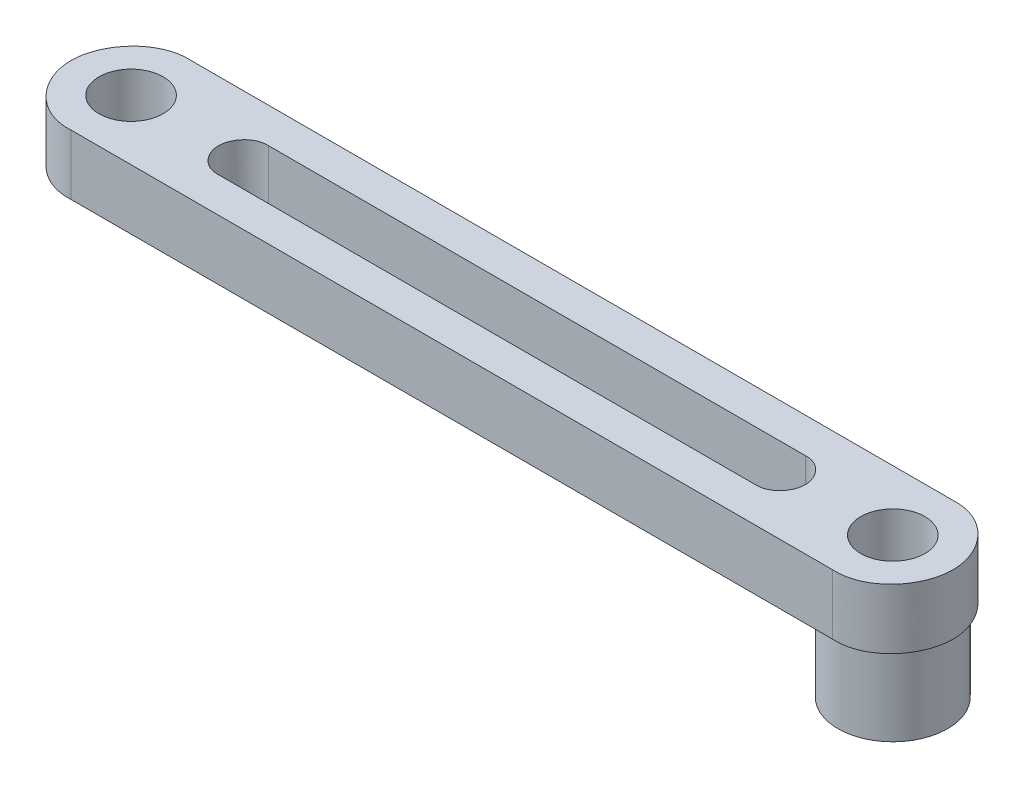
ISO-10303-21;
HEADER;
FILE_DESCRIPTION(('STEP AP214'),'2;1');
FILE_NAME('part.step','',(''),(''),'','','');
FILE_SCHEMA(('AUTOMOTIVE_DESIGN { 1 0 10303 214 1 1 1 1 }'));
ENDSEC;
DATA;
#1=APPLICATION_CONTEXT('core data for automotive mechanical design processes');
#2=APPLICATION_PROTOCOL_DEFINITION('international standard','automotive_design',2000,#1);
#3=PRODUCT_CONTEXT('',#1,'mechanical');
#4=PRODUCT('Part','Part','',(#3));
#5=PRODUCT_RELATED_PRODUCT_CATEGORY('part','',(#4));
#6=PRODUCT_DEFINITION_FORMATION('','',#4);
#7=PRODUCT_DEFINITION_CONTEXT('part definition',#1,'design');
#8=PRODUCT_DEFINITION('design','',#6,#7);
#9=PRODUCT_DEFINITION_SHAPE('','',#8);
#10=(LENGTH_UNIT() NAMED_UNIT(*) SI_UNIT(.MILLI.,.METRE.));
#11=(NAMED_UNIT(*) PLANE_ANGLE_UNIT() SI_UNIT($,.RADIAN.));
#12=(NAMED_UNIT(*) SI_UNIT($,.STERADIAN.) SOLID_ANGLE_UNIT());
#13=UNCERTAINTY_MEASURE_WITH_UNIT(LENGTH_MEASURE(1.E-05),#10,'distance_accuracy_value','');
#14=(GEOMETRIC_REPRESENTATION_CONTEXT(3) GLOBAL_UNCERTAINTY_ASSIGNED_CONTEXT((#13)) GLOBAL_UNIT_ASSIGNED_CONTEXT((#10,
#11,#12)) REPRESENTATION_CONTEXT('',''));
#15=CARTESIAN_POINT('',(0.,0.,0.));
#16=DIRECTION('',(0.,0.,1.));
#17=DIRECTION('',(1.,0.,0.));
#18=AXIS2_PLACEMENT_3D('',#15,#16,#17);
#19=CARTESIAN_POINT('',(-21.9999999624568,0.,4.24554516426121E-05));
#20=DIRECTION('',(0.,-1.,0.));
#21=DIRECTION('',(0.,0.,-1.));
#22=AXIS2_PLACEMENT_3D('',#19,#20,#21);
#23=PLANE('',#22);
#24=CARTESIAN_POINT('',(13.3903767782908,0.,1.25000000000001));
#25=CARTESIAN_POINT('',(14.0849333382027,0.,1.28838266320165));
#26=CARTESIAN_POINT('',(15.2054573426166,0.,0.00659589038419318));
#27=CARTESIAN_POINT('',(14.065682357155,0.,-1.29855146414271));
#28=CARTESIAN_POINT('',(13.3903767782908,0.,-1.25000000000001));
#29=B_SPLINE_CURVE_WITH_KNOTS('',3,(#24,#25,#26,#27,#28),.UNSPECIFIED.,.F.,.F.,(4,1,4),(0.,
0.500292138464268,1.),.UNSPECIFIED.);
#30=CARTESIAN_POINT('',(13.3903767782908,0.,1.25));
#31=VERTEX_POINT('',#30);
#32=CARTESIAN_POINT('',(13.3903767782908,0.,-1.25));
#33=VERTEX_POINT('',#32);
#34=EDGE_CURVE('E100',#31,#33,#29,.T.);
#35=ORIENTED_EDGE('',*,*,#34,.T.);
#36=DIRECTION('',(-1.,0.,0.));
#37=VECTOR('',#36,1.);
#38=CARTESIAN_POINT('',(13.3903767782908,0.,-1.25));
#39=LINE('',#38,#37);
#40=CARTESIAN_POINT('',(-13.3903767782908,0.,-1.25));
#41=VERTEX_POINT('',#40);
#42=EDGE_CURVE('E109',#33,#41,#39,.T.);
#43=ORIENTED_EDGE('',*,*,#42,.T.);
#44=CARTESIAN_POINT('',(-13.3903767782908,0.,-1.25000000000001));
#45=CARTESIAN_POINT('',(-14.0916037180322,0.,-1.29014532889854));
#46=CARTESIAN_POINT('',(-15.1894504002479,0.,-0.000117244615795889));
#47=CARTESIAN_POINT('',(-14.091002551522,0.,1.2905789269822));
#48=CARTESIAN_POINT('',(-13.3903767782908,0.,1.25000000000001));
#49=B_SPLINE_CURVE_WITH_KNOTS('',3,(#44,#45,#46,#47,#48),.UNSPECIFIED.,.F.,.F.,(4,1,4),(0.,
0.499980711921023,1.),.UNSPECIFIED.);
#50=CARTESIAN_POINT('',(-13.3903767782908,0.,1.25));
#51=VERTEX_POINT('',#50);
#52=EDGE_CURVE('E48',#41,#51,#49,.T.);
#53=ORIENTED_EDGE('',*,*,#52,.T.);
#54=DIRECTION('',(1.,0.,0.));
#55=VECTOR('',#54,1.);
#56=CARTESIAN_POINT('',(13.3903767782908,0.,1.25));
#57=LINE('',#56,#55);
#58=EDGE_CURVE('E106',#51,#31,#57,.T.);
#59=ORIENTED_EDGE('',*,*,#58,.T.);
#60=EDGE_LOOP('',(#35,#43,#53,#59));
#61=FACE_BOUND('',#60,.T.);
#62=CARTESIAN_POINT('',(-19.,0.,-3.));
#63=CARTESIAN_POINT('',(-20.6610978152887,0.,-3.102497636576));
#64=CARTESIAN_POINT('',(-23.3416471052254,0.,-0.00157466970596306));
#65=CARTESIAN_POINT('',(-20.6556078745915,0.,3.10576019052511));
#66=CARTESIAN_POINT('',(-19.,0.,3.));
#67=B_SPLINE_CURVE_WITH_KNOTS('',3,(#62,#63,#64,#65,#66),.UNSPECIFIED.,.F.,.F.,(4,1,4),(0.,
0.49999544096988,1.),.UNSPECIFIED.);
#68=CARTESIAN_POINT('',(-19.,0.,-3.));
#69=VERTEX_POINT('',#68);
#70=CARTESIAN_POINT('',(-19.,0.,3.));
#71=VERTEX_POINT('',#70);
#72=EDGE_CURVE('E177',#69,#71,#67,.T.);
#73=ORIENTED_EDGE('',*,*,#72,.F.);
#74=DIRECTION('',(-1.,0.,0.));
#75=VECTOR('',#74,1.);
#76=CARTESIAN_POINT('',(-19.,0.,-3.));
#77=LINE('',#76,#75);
#78=CARTESIAN_POINT('',(19.,0.,-3.));
#79=VERTEX_POINT('',#78);
#80=EDGE_CURVE('E192',#79,#69,#77,.T.);
#81=ORIENTED_EDGE('',*,*,#80,.F.);
#82=CARTESIAN_POINT('',(19.,0.,3.));
#83=CARTESIAN_POINT('',(20.6823646239141,0.,3.09756945926153));
#84=CARTESIAN_POINT('',(23.3156215092886,0.,-0.000753175394209666));
#85=CARTESIAN_POINT('',(20.686391490493,0.,-3.09462000285487));
#86=CARTESIAN_POINT('',(19.,0.,-3.));
#87=B_SPLINE_CURVE_WITH_KNOTS('',3,(#82,#83,#84,#85,#86),.UNSPECIFIED.,.F.,.F.,(4,1,4),(0.,
0.500058263142931,1.),.UNSPECIFIED.);
#88=CARTESIAN_POINT('',(19.,0.,3.));
#89=VERTEX_POINT('',#88);
#90=EDGE_CURVE('E188',#89,#79,#87,.T.);
#91=ORIENTED_EDGE('',*,*,#90,.F.);
#92=DIRECTION('',(1.,0.,0.));
#93=VECTOR('',#92,1.);
#94=CARTESIAN_POINT('',(-19.,0.,3.));
#95=LINE('',#94,#93);
#96=EDGE_CURVE('E182',#71,#89,#95,.T.);
#97=ORIENTED_EDGE('',*,*,#96,.F.);
#98=EDGE_LOOP('',(#73,#81,#91,#97));
#99=FACE_BOUND('',#98,.T.);
#100=CARTESIAN_POINT('',(-19.,0.,0.));
#101=DIRECTION('',(0.,1.,0.));
#102=DIRECTION('',(0.,0.,1.));
#103=AXIS2_PLACEMENT_3D('',#100,#101,#102);
#104=CIRCLE('',#103,1.6);
#105=CARTESIAN_POINT('',(-19.,0.,1.6));
#106=VERTEX_POINT('',#105);
#107=EDGE_CURVE('E222',#106,#106,#104,.T.);
#108=ORIENTED_EDGE('',*,*,#107,.T.);
#109=EDGE_LOOP('',(#108));
#110=FACE_BOUND('',#109,.T.);
#111=CARTESIAN_POINT('',(19.,0.,0.));
#112=DIRECTION('',(0.,-1.,0.));
#113=DIRECTION('',(0.,0.,-1.));
#114=AXIS2_PLACEMENT_3D('',#111,#112,#113);
#115=CIRCLE('',#114,2.7347435294966);
#116=CARTESIAN_POINT('',(19.,0.,-2.7347435294966));
#117=VERTEX_POINT('',#116);
#118=EDGE_CURVE('E234',#117,#117,#115,.T.);
#119=ORIENTED_EDGE('',*,*,#118,.F.);
#120=EDGE_LOOP('',(#119));
#121=FACE_BOUND('',#120,.T.);
#122=ADVANCED_FACE('F32',(#61,#99,#110,#121),#23,.T.);
#123=CARTESIAN_POINT('',(-21.9999999624568,3.,4.24554516426121E-05));
#124=DIRECTION('',(0.,-1.,0.));
#125=DIRECTION('',(0.,0.,-1.));
#126=AXIS2_PLACEMENT_3D('',#123,#124,#125);
#127=PLANE('',#126);
#128=DIRECTION('',(-1.,0.,0.));
#129=VECTOR('',#128,1.);
#130=CARTESIAN_POINT('',(13.3903767782908,3.,-1.25));
#131=LINE('',#130,#129);
#132=CARTESIAN_POINT('',(13.3903767782908,3.,-1.25));
#133=VERTEX_POINT('',#132);
#134=CARTESIAN_POINT('',(-13.3903767782908,3.,-1.25000000000001));
#135=VERTEX_POINT('',#134);
#136=EDGE_CURVE('E251',#133,#135,#131,.T.);
#137=ORIENTED_EDGE('',*,*,#136,.F.);
#138=CARTESIAN_POINT('',(13.3903767782908,3.,1.25000000000001));
#139=CARTESIAN_POINT('',(14.0849333382027,3.,1.28838266320165));
#140=CARTESIAN_POINT('',(15.2054573426166,3.,0.00659589038419318));
#141=CARTESIAN_POINT('',(14.065682357155,3.,-1.29855146414271));
#142=CARTESIAN_POINT('',(13.3903767782908,3.,-1.25000000000001));
#143=B_SPLINE_CURVE_WITH_KNOTS('',3,(#138,#139,#140,#141,#142),.UNSPECIFIED.,.F.,.F.,(4,1,4),
(0.,0.500292138464268,1.),.UNSPECIFIED.);
#144=CARTESIAN_POINT('',(13.3903767782908,3.,1.25));
#145=VERTEX_POINT('',#144);
#146=EDGE_CURVE('E56',#145,#133,#143,.T.);
#147=ORIENTED_EDGE('',*,*,#146,.F.);
#148=DIRECTION('',(1.,0.,0.));
#149=VECTOR('',#148,1.);
#150=CARTESIAN_POINT('',(13.3903767782908,3.,1.25));
#151=LINE('',#150,#149);
#152=CARTESIAN_POINT('',(-13.3903767782908,3.,1.25));
#153=VERTEX_POINT('',#152);
#154=EDGE_CURVE('E115',#153,#145,#151,.T.);
#155=ORIENTED_EDGE('',*,*,#154,.F.);
#156=CARTESIAN_POINT('',(-13.3903767782908,3.,-1.25000000000001));
#157=CARTESIAN_POINT('',(-14.0916037180322,3.,-1.29014532889854));
#158=CARTESIAN_POINT('',(-15.1894504002479,3.,-0.000117244615795889));
#159=CARTESIAN_POINT('',(-14.091002551522,3.,1.2905789269822));
#160=CARTESIAN_POINT('',(-13.3903767782908,3.,1.25000000000001));
#161=B_SPLINE_CURVE_WITH_KNOTS('',3,(#156,#157,#158,#159,#160),.UNSPECIFIED.,.F.,.F.,(4,1,4),
(0.,0.499980711921023,1.),.UNSPECIFIED.);
#162=EDGE_CURVE('E118',#135,#153,#161,.T.);
#163=ORIENTED_EDGE('',*,*,#162,.F.);
#164=EDGE_LOOP('',(#137,#147,#155,#163));
#165=FACE_BOUND('',#164,.T.);
#166=CARTESIAN_POINT('',(-19.,3.,-3.));
#167=CARTESIAN_POINT('',(-20.6610978152887,3.,-3.102497636576));
#168=CARTESIAN_POINT('',(-23.3416471052254,3.,-0.00157466970596306));
#169=CARTESIAN_POINT('',(-20.6556078745915,3.,3.10576019052511));
#170=CARTESIAN_POINT('',(-19.,3.,3.));
#171=B_SPLINE_CURVE_WITH_KNOTS('',3,(#166,#167,#168,#169,#170),.UNSPECIFIED.,.F.,.F.,(4,1,4),
(0.,0.49999544096988,1.),.UNSPECIFIED.);
#172=CARTESIAN_POINT('',(-19.,3.,-3.));
#173=VERTEX_POINT('',#172);
#174=CARTESIAN_POINT('',(-19.,3.,3.));
#175=VERTEX_POINT('',#174);
#176=EDGE_CURVE('E197',#173,#175,#171,.T.);
#177=ORIENTED_EDGE('',*,*,#176,.T.);
#178=DIRECTION('',(1.,0.,0.));
#179=VECTOR('',#178,1.);
#180=CARTESIAN_POINT('',(-19.,3.,3.));
#181=LINE('',#180,#179);
#182=CARTESIAN_POINT('',(19.,3.,3.));
#183=VERTEX_POINT('',#182);
#184=EDGE_CURVE('E171',#175,#183,#181,.T.);
#185=ORIENTED_EDGE('',*,*,#184,.T.);
#186=CARTESIAN_POINT('',(19.,3.,3.));
#187=CARTESIAN_POINT('',(20.6823646239141,3.,3.09756945926153));
#188=CARTESIAN_POINT('',(23.3156215092886,3.,-0.000753175394209666));
#189=CARTESIAN_POINT('',(20.686391490493,3.,-3.09462000285487));
#190=CARTESIAN_POINT('',(19.,3.,-3.));
#191=B_SPLINE_CURVE_WITH_KNOTS('',3,(#186,#187,#188,#189,#190),.UNSPECIFIED.,.F.,.F.,(4,1,4),
(0.,0.500058263142931,1.),.UNSPECIFIED.);
#192=CARTESIAN_POINT('',(19.,3.,-3.));
#193=VERTEX_POINT('',#192);
#194=EDGE_CURVE('E164',#183,#193,#191,.T.);
#195=ORIENTED_EDGE('',*,*,#194,.T.);
#196=DIRECTION('',(-1.,0.,0.));
#197=VECTOR('',#196,1.);
#198=CARTESIAN_POINT('',(-19.,3.,-3.));
#199=LINE('',#198,#197);
#200=EDGE_CURVE('E170',#193,#173,#199,.T.);
#201=ORIENTED_EDGE('',*,*,#200,.T.);
#202=EDGE_LOOP('',(#177,#185,#195,#201));
#203=FACE_BOUND('',#202,.T.);
#204=CARTESIAN_POINT('',(-19.,3.,0.));
#205=DIRECTION('',(0.,1.,0.));
#206=DIRECTION('',(0.,0.,1.));
#207=AXIS2_PLACEMENT_3D('',#204,#205,#206);
#208=CIRCLE('',#207,1.6);
#209=CARTESIAN_POINT('',(-19.,3.,1.6));
#210=VERTEX_POINT('',#209);
#211=EDGE_CURVE('E183',#210,#210,#208,.T.);
#212=ORIENTED_EDGE('',*,*,#211,.F.);
#213=EDGE_LOOP('',(#212));
#214=FACE_BOUND('',#213,.T.);
#215=CARTESIAN_POINT('',(19.,3.,0.));
#216=DIRECTION('',(0.,1.,0.));
#217=DIRECTION('',(0.,0.,-1.));
#218=AXIS2_PLACEMENT_3D('',#215,#216,#217);
#219=CIRCLE('',#218,1.6);
#220=CARTESIAN_POINT('',(19.,3.,-1.6));
#221=VERTEX_POINT('',#220);
#222=EDGE_CURVE('E228',#221,#221,#219,.T.);
#223=ORIENTED_EDGE('',*,*,#222,.F.);
#224=EDGE_LOOP('',(#223));
#225=FACE_BOUND('',#224,.T.);
#226=ADVANCED_FACE('F150',(#165,#203,#214,#225),#127,.F.);
#227=DIRECTION('',(0.,-1.,0.));
#228=VECTOR('',#227,1.);
#229=SURFACE_OF_LINEAR_EXTRUSION('',#171,#228);
#230=ORIENTED_EDGE('',*,*,#72,.T.);
#231=DIRECTION('',(0.,-1.,0.));
#232=VECTOR('',#231,1.);
#233=CARTESIAN_POINT('',(-19.,3.,3.));
#234=LINE('',#233,#232);
#235=EDGE_CURVE('E11',#175,#71,#234,.T.);
#236=ORIENTED_EDGE('',*,*,#235,.F.);
#237=ORIENTED_EDGE('',*,*,#176,.F.);
#238=DIRECTION('',(0.,-1.,0.));
#239=VECTOR('',#238,1.);
#240=CARTESIAN_POINT('',(-19.,3.,-3.));
#241=LINE('',#240,#239);
#242=EDGE_CURVE('E176',#173,#69,#241,.T.);
#243=ORIENTED_EDGE('',*,*,#242,.T.);
#244=EDGE_LOOP('',(#230,#236,#237,#243));
#245=FACE_BOUND('',#244,.T.);
#246=ADVANCED_FACE('F34',(#245),#229,.F.);
#247=CARTESIAN_POINT('',(-19.,3.,3.));
#248=DIRECTION('',(0.,0.,-1.));
#249=DIRECTION('',(-1.,0.,0.));
#250=AXIS2_PLACEMENT_3D('',#247,#248,#249);
#251=PLANE('',#250);
#252=ORIENTED_EDGE('',*,*,#96,.T.);
#253=DIRECTION('',(0.,-1.,0.));
#254=VECTOR('',#253,1.);
#255=CARTESIAN_POINT('',(19.,3.,3.));
#256=LINE('',#255,#254);
#257=EDGE_CURVE('E41',#183,#89,#256,.T.);
#258=ORIENTED_EDGE('',*,*,#257,.F.);
#259=ORIENTED_EDGE('',*,*,#184,.F.);
#260=ORIENTED_EDGE('',*,*,#235,.T.);
#261=EDGE_LOOP('',(#252,#258,#259,#260));
#262=FACE_BOUND('',#261,.T.);
#263=ADVANCED_FACE('F162',(#262),#251,.F.);
#264=DIRECTION('',(0.,-1.,0.));
#265=VECTOR('',#264,1.);
#266=SURFACE_OF_LINEAR_EXTRUSION('',#191,#265);
#267=ORIENTED_EDGE('',*,*,#90,.T.);
#268=DIRECTION('',(0.,-1.,0.));
#269=VECTOR('',#268,1.);
#270=CARTESIAN_POINT('',(19.,3.,-3.));
#271=LINE('',#270,#269);
#272=EDGE_CURVE('E200',#193,#79,#271,.T.);
#273=ORIENTED_EDGE('',*,*,#272,.F.);
#274=ORIENTED_EDGE('',*,*,#194,.F.);
#275=ORIENTED_EDGE('',*,*,#257,.T.);
#276=EDGE_LOOP('',(#267,#273,#274,#275));
#277=FACE_BOUND('',#276,.T.);
#278=ADVANCED_FACE('F158',(#277),#266,.F.);
#279=CARTESIAN_POINT('',(-19.,3.,-3.));
#280=DIRECTION('',(0.,0.,1.));
#281=DIRECTION('',(1.,0.,0.));
#282=AXIS2_PLACEMENT_3D('',#279,#280,#281);
#283=PLANE('',#282);
#284=ORIENTED_EDGE('',*,*,#80,.T.);
#285=ORIENTED_EDGE('',*,*,#242,.F.);
#286=ORIENTED_EDGE('',*,*,#200,.F.);
#287=ORIENTED_EDGE('',*,*,#272,.T.);
#288=EDGE_LOOP('',(#284,#285,#286,#287));
#289=FACE_BOUND('',#288,.T.);
#290=ADVANCED_FACE('F148',(#289),#283,.F.);
#291=CARTESIAN_POINT('',(-19.,3.,0.));
#292=DIRECTION('',(0.,-1.,0.));
#293=DIRECTION('',(0.,0.,-1.));
#294=AXIS2_PLACEMENT_3D('',#291,#292,#293);
#295=CYLINDRICAL_SURFACE('',#294,1.6);
#296=ORIENTED_EDGE('',*,*,#211,.T.);
#297=EDGE_LOOP('',(#296));
#298=FACE_BOUND('',#297,.T.);
#299=ORIENTED_EDGE('',*,*,#107,.F.);
#300=EDGE_LOOP('',(#299));
#301=FACE_BOUND('',#300,.T.);
#302=ADVANCED_FACE('F144',(#298,#301),#295,.F.);
#303=CARTESIAN_POINT('',(19.,3.,0.));
#304=DIRECTION('',(0.,-1.,0.));
#305=DIRECTION('',(0.,0.,-1.));
#306=AXIS2_PLACEMENT_3D('',#303,#304,#305);
#307=CYLINDRICAL_SURFACE('',#306,1.6);
#308=ORIENTED_EDGE('',*,*,#222,.T.);
#309=EDGE_LOOP('',(#308));
#310=FACE_BOUND('',#309,.T.);
#311=CARTESIAN_POINT('',(19.,-4.,0.));
#312=DIRECTION('',(0.,-1.,0.));
#313=DIRECTION('',(0.,0.,-1.));
#314=AXIS2_PLACEMENT_3D('',#311,#312,#313);
#315=CIRCLE('',#314,1.6);
#316=CARTESIAN_POINT('',(19.,-4.,-1.6));
#317=VERTEX_POINT('',#316);
#318=EDGE_CURVE('E237',#317,#317,#315,.T.);
#319=ORIENTED_EDGE('',*,*,#318,.T.);
#320=EDGE_LOOP('',(#319));
#321=FACE_BOUND('',#320,.T.);
#322=ADVANCED_FACE('F137',(#310,#321),#307,.F.);
#323=CARTESIAN_POINT('',(19.,-4.,0.));
#324=DIRECTION('',(0.,-1.,0.));
#325=DIRECTION('',(0.,0.,-1.));
#326=AXIS2_PLACEMENT_3D('',#323,#324,#325);
#327=PLANE('',#326);
#328=CARTESIAN_POINT('',(19.,-4.,0.));
#329=DIRECTION('',(0.,-1.,0.));
#330=DIRECTION('',(0.,0.,-1.));
#331=AXIS2_PLACEMENT_3D('',#328,#329,#330);
#332=CIRCLE('',#331,2.7347435294966);
#333=CARTESIAN_POINT('',(19.,-4.,-2.7347435294966));
#334=VERTEX_POINT('',#333);
#335=EDGE_CURVE('E233',#334,#334,#332,.T.);
#336=ORIENTED_EDGE('',*,*,#335,.T.);
#337=EDGE_LOOP('',(#336));
#338=FACE_BOUND('',#337,.T.);
#339=ORIENTED_EDGE('',*,*,#318,.F.);
#340=EDGE_LOOP('',(#339));
#341=FACE_BOUND('',#340,.T.);
#342=ADVANCED_FACE('F134',(#338,#341),#327,.T.);
#343=CARTESIAN_POINT('',(19.,-4.,0.));
#344=DIRECTION('',(0.,1.,0.));
#345=DIRECTION('',(0.,0.,1.));
#346=AXIS2_PLACEMENT_3D('',#343,#344,#345);
#347=CYLINDRICAL_SURFACE('',#346,2.7347435294966);
#348=ORIENTED_EDGE('',*,*,#335,.F.);
#349=EDGE_LOOP('',(#348));
#350=FACE_BOUND('',#349,.T.);
#351=ORIENTED_EDGE('',*,*,#118,.T.);
#352=EDGE_LOOP('',(#351));
#353=FACE_BOUND('',#352,.T.);
#354=ADVANCED_FACE('F132',(#350,#353),#347,.T.);
#355=DIRECTION('',(0.,1.,0.));
#356=VECTOR('',#355,1.);
#357=SURFACE_OF_LINEAR_EXTRUSION('',#29,#356);
#358=ORIENTED_EDGE('',*,*,#146,.T.);
#359=DIRECTION('',(0.,1.,0.));
#360=VECTOR('',#359,1.);
#361=CARTESIAN_POINT('',(13.3903767782908,0.,-1.25));
#362=LINE('',#361,#360);
#363=EDGE_CURVE('E96',#33,#133,#362,.T.);
#364=ORIENTED_EDGE('',*,*,#363,.F.);
#365=ORIENTED_EDGE('',*,*,#34,.F.);
#366=DIRECTION('',(0.,1.,0.));
#367=VECTOR('',#366,1.);
#368=CARTESIAN_POINT('',(13.3903767782908,0.,1.25));
#369=LINE('',#368,#367);
#370=EDGE_CURVE('E241',#31,#145,#369,.T.);
#371=ORIENTED_EDGE('',*,*,#370,.T.);
#372=EDGE_LOOP('',(#358,#364,#365,#371));
#373=FACE_BOUND('',#372,.T.);
#374=ADVANCED_FACE('F98',(#373),#357,.F.);
#375=CARTESIAN_POINT('',(13.3903767782908,0.,1.25));
#376=DIRECTION('',(0.,0.,1.));
#377=DIRECTION('',(1.,0.,0.));
#378=AXIS2_PLACEMENT_3D('',#375,#376,#377);
#379=PLANE('',#378);
#380=ORIENTED_EDGE('',*,*,#154,.T.);
#381=ORIENTED_EDGE('',*,*,#370,.F.);
#382=ORIENTED_EDGE('',*,*,#58,.F.);
#383=DIRECTION('',(0.,1.,0.));
#384=VECTOR('',#383,1.);
#385=CARTESIAN_POINT('',(-13.3903767782908,0.,1.25));
#386=LINE('',#385,#384);
#387=EDGE_CURVE('E244',#51,#153,#386,.T.);
#388=ORIENTED_EDGE('',*,*,#387,.T.);
#389=EDGE_LOOP('',(#380,#381,#382,#388));
#390=FACE_BOUND('',#389,.T.);
#391=ADVANCED_FACE('F131',(#390),#379,.F.);
#392=DIRECTION('',(0.,1.,0.));
#393=VECTOR('',#392,1.);
#394=SURFACE_OF_LINEAR_EXTRUSION('',#49,#393);
#395=ORIENTED_EDGE('',*,*,#162,.T.);
#396=ORIENTED_EDGE('',*,*,#387,.F.);
#397=ORIENTED_EDGE('',*,*,#52,.F.);
#398=DIRECTION('',(0.,1.,0.));
#399=VECTOR('',#398,1.);
#400=CARTESIAN_POINT('',(-13.3903767782908,0.,-1.25000000000001));
#401=LINE('',#400,#399);
#402=EDGE_CURVE('E105',#41,#135,#401,.T.);
#403=ORIENTED_EDGE('',*,*,#402,.T.);
#404=EDGE_LOOP('',(#395,#396,#397,#403));
#405=FACE_BOUND('',#404,.T.);
#406=ADVANCED_FACE('F268',(#405),#394,.F.);
#407=CARTESIAN_POINT('',(13.3903767782908,0.,-1.25));
#408=DIRECTION('',(0.,0.,-1.));
#409=DIRECTION('',(-1.,0.,0.));
#410=AXIS2_PLACEMENT_3D('',#407,#408,#409);
#411=PLANE('',#410);
#412=ORIENTED_EDGE('',*,*,#136,.T.);
#413=ORIENTED_EDGE('',*,*,#402,.F.);
#414=ORIENTED_EDGE('',*,*,#42,.F.);
#415=ORIENTED_EDGE('',*,*,#363,.T.);
#416=EDGE_LOOP('',(#412,#413,#414,#415));
#417=FACE_BOUND('',#416,.T.);
#418=ADVANCED_FACE('F110',(#417),#411,.F.);
#419=CLOSED_SHELL('',(#122,#226,#246,#263,#278,#290,#302,#322,#342,#354,#374,#391,#406,#418));
#420=MANIFOLD_SOLID_BREP('B2',#419);
#421=ADVANCED_BREP_SHAPE_REPRESENTATION('',(#18,#420),#14);
#422=SHAPE_DEFINITION_REPRESENTATION(#9,#421);
ENDSEC;
END-ISO-10303-21;
